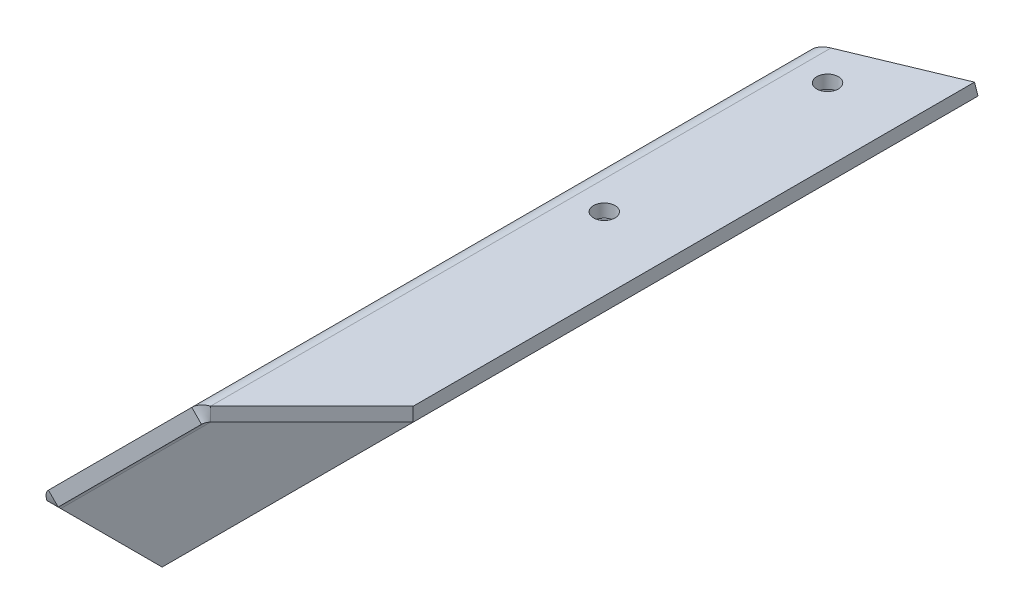
ISO-10303-21;
HEADER;
FILE_DESCRIPTION(('STEP AP214'),'2;1');
FILE_NAME('part.step','',(''),(''),'','','');
FILE_SCHEMA(('AUTOMOTIVE_DESIGN { 1 0 10303 214 1 1 1 1 }'));
ENDSEC;
DATA;
#1=APPLICATION_CONTEXT('core data for automotive mechanical design processes');
#2=APPLICATION_PROTOCOL_DEFINITION('international standard','automotive_design',2000,#1);
#3=PRODUCT_CONTEXT('',#1,'mechanical');
#4=PRODUCT('Part','Part','',(#3));
#5=PRODUCT_RELATED_PRODUCT_CATEGORY('part','',(#4));
#6=PRODUCT_DEFINITION_FORMATION('','',#4);
#7=PRODUCT_DEFINITION_CONTEXT('part definition',#1,'design');
#8=PRODUCT_DEFINITION('design','',#6,#7);
#9=PRODUCT_DEFINITION_SHAPE('','',#8);
#10=(LENGTH_UNIT() NAMED_UNIT(*) SI_UNIT(.MILLI.,.METRE.));
#11=(NAMED_UNIT(*) PLANE_ANGLE_UNIT() SI_UNIT($,.RADIAN.));
#12=(NAMED_UNIT(*) SI_UNIT($,.STERADIAN.) SOLID_ANGLE_UNIT());
#13=UNCERTAINTY_MEASURE_WITH_UNIT(LENGTH_MEASURE(1.E-05),#10,'distance_accuracy_value','');
#14=(GEOMETRIC_REPRESENTATION_CONTEXT(3) GLOBAL_UNCERTAINTY_ASSIGNED_CONTEXT((#13)) GLOBAL_UNIT_ASSIGNED_CONTEXT((#10,
#11,#12)) REPRESENTATION_CONTEXT('',''));
#15=CARTESIAN_POINT('',(0.,0.,0.));
#16=DIRECTION('',(0.,0.,1.));
#17=DIRECTION('',(1.,0.,0.));
#18=AXIS2_PLACEMENT_3D('',#15,#16,#17);
#19=CARTESIAN_POINT('',(-93.8086894866069,111.769201728745,112.900713999999));
#20=DIRECTION('',(0.707106781186544,-0.707106781186551,0.));
#21=DIRECTION('',(0.,0.,-1.));
#22=AXIS2_PLACEMENT_3D('',#19,#20,#21);
#23=PLANE('',#22);
#24=DIRECTION('',(-0.702428633356952,-0.702428633356945,0.114839148728036));
#25=VECTOR('',#24,1.);
#26=CARTESIAN_POINT('',(-101.157491422329,104.420399793023,23.0009026953148));
#27=LINE('',#26,#25);
#28=CARTESIAN_POINT('',(-94.4931223603302,111.084768855022,21.9113536172371));
#29=VERTEX_POINT('',#28);
#30=CARTESIAN_POINT('',(-111.084768855022,94.4931223603303,24.6239004425864));
#31=VERTEX_POINT('',#30);
#32=EDGE_CURVE('E201',#29,#31,#27,.T.);
#33=ORIENTED_EDGE('',*,*,#32,.F.);
#34=DIRECTION('',(0.,0.,1.));
#35=VECTOR('',#34,1.);
#36=CARTESIAN_POINT('',(-94.4931223603302,111.084768855022,112.900713999999));
#37=LINE('',#36,#35);
#38=CARTESIAN_POINT('',(-94.4931223603302,111.084768855022,94.4931223603293));
#39=VERTEX_POINT('',#38);
#40=EDGE_CURVE('E104',#39,#29,#37,.F.);
#41=ORIENTED_EDGE('',*,*,#40,.F.);
#42=DIRECTION('',(-0.707106781186551,-0.707106781186544,0.));
#43=VECTOR('',#42,1.);
#44=CARTESIAN_POINT('',(-94.4931223603302,111.084768855022,94.4931223603293));
#45=LINE('',#44,#43);
#46=CARTESIAN_POINT('',(-111.084768855022,94.4931223603304,94.4931223603293));
#47=VERTEX_POINT('',#46);
#48=EDGE_CURVE('E219',#39,#47,#45,.T.);
#49=ORIENTED_EDGE('',*,*,#48,.T.);
#50=DIRECTION('',(0.,0.,-1.));
#51=VECTOR('',#50,1.);
#52=CARTESIAN_POINT('',(-111.084768855022,94.4931223603303,-112.900714000001));
#53=LINE('',#52,#51);
#54=EDGE_CURVE('E36',#31,#47,#53,.F.);
#55=ORIENTED_EDGE('',*,*,#54,.F.);
#56=EDGE_LOOP('',(#33,#41,#49,#55));
#57=FACE_BOUND('',#56,.T.);
#58=ADVANCED_FACE('F32',(#57),#23,.T.);
#59=CARTESIAN_POINT('',(-94.9402017578616,112.900714,112.900713999999));
#60=DIRECTION('',(0.707106781186544,-0.707106781186551,0.));
#61=DIRECTION('',(0.,0.,-1.));
#62=AXIS2_PLACEMENT_3D('',#59,#60,#61);
#63=PLANE('',#62);
#64=DIRECTION('',(0.,0.,1.));
#65=VECTOR('',#64,1.);
#66=CARTESIAN_POINT('',(-95.6246346315849,112.216281126277,112.900713999999));
#67=LINE('',#66,#65);
#68=CARTESIAN_POINT('',(-95.6246346315849,112.216281126277,94.4931223603293));
#69=VERTEX_POINT('',#68);
#70=CARTESIAN_POINT('',(-95.6246346315849,112.216281126277,22.6683393567157));
#71=VERTEX_POINT('',#70);
#72=EDGE_CURVE('E110',#69,#71,#67,.F.);
#73=ORIENTED_EDGE('',*,*,#72,.T.);
#74=DIRECTION('',(-0.702428633356952,-0.702428633356945,0.114839148728036));
#75=VECTOR('',#74,1.);
#76=CARTESIAN_POINT('',(-102.227940450061,105.612975307801,23.7479052840906));
#77=LINE('',#76,#75);
#78=CARTESIAN_POINT('',(-112.216281126277,95.6246346315851,25.380886182065));
#79=VERTEX_POINT('',#78);
#80=EDGE_CURVE('E198',#71,#79,#77,.T.);
#81=ORIENTED_EDGE('',*,*,#80,.T.);
#82=DIRECTION('',(0.,0.,-1.));
#83=VECTOR('',#82,1.);
#84=CARTESIAN_POINT('',(-112.216281126277,95.6246346315851,-112.900714000001));
#85=LINE('',#84,#83);
#86=CARTESIAN_POINT('',(-112.216281126277,95.6246346315851,94.4931223603293));
#87=VERTEX_POINT('',#86);
#88=EDGE_CURVE('E42',#79,#87,#85,.F.);
#89=ORIENTED_EDGE('',*,*,#88,.T.);
#90=DIRECTION('',(0.707106781186551,0.707106781186544,0.));
#91=VECTOR('',#90,1.);
#92=CARTESIAN_POINT('',(-94.9402017578616,112.900714,94.4931223603293));
#93=LINE('',#92,#91);
#94=EDGE_CURVE('E220',#69,#87,#93,.F.);
#95=ORIENTED_EDGE('',*,*,#94,.F.);
#96=EDGE_LOOP('',(#73,#81,#89,#95));
#97=FACE_BOUND('',#96,.T.);
#98=ADVANCED_FACE('F34',(#97),#63,.F.);
#99=CARTESIAN_POINT('',(-93.9722675053082,110.563914,112.900713999999));
#100=DIRECTION('',(0.,0.,1.));
#101=DIRECTION('',(0.,1.,0.));
#102=AXIS2_PLACEMENT_3D('',#99,#100,#101);
#103=CYLINDRICAL_SURFACE('',#102,2.3368);
#104=CARTESIAN_POINT('',(-93.9722675053082,110.563914,21.5628998641438));
#105=DIRECTION('',(0.374230803028497,-0.22724442901572,0.899061330247256));
#106=DIRECTION('',(-0.768476455717074,0.466642489015403,0.437822708929121));
#107=AXIS2_PLACEMENT_3D('',#104,#105,#106);
#108=ELLIPSE('',#107,2.59915527604478,2.3368);
#109=CARTESIAN_POINT('',(-93.9722675053082,112.900714,22.1535434207718));
#110=VERTEX_POINT('',#109);
#111=EDGE_CURVE('E207',#71,#110,#108,.F.);
#112=ORIENTED_EDGE('',*,*,#111,.F.);
#113=ORIENTED_EDGE('',*,*,#72,.F.);
#114=CARTESIAN_POINT('',(-93.9722675053082,110.563914,93.9722675053073));
#115=DIRECTION('',(-0.300635186420926,0.,-0.953739212093985));
#116=DIRECTION('',(-0.953739212093985,0.,0.300635186420926));
#117=AXIS2_PLACEMENT_3D('',#114,#115,#116);
#118=ELLIPSE('',#117,2.45014566913887,2.3368);
#119=CARTESIAN_POINT('',(-93.9722675053082,112.900714,93.9722675053073));
#120=VERTEX_POINT('',#119);
#121=EDGE_CURVE('E145',#120,#69,#118,.F.);
#122=ORIENTED_EDGE('',*,*,#121,.F.);
#123=DIRECTION('',(0.,0.,1.));
#124=VECTOR('',#123,1.);
#125=CARTESIAN_POINT('',(-93.9722675053082,112.900714,-112.900714000001));
#126=LINE('',#125,#124);
#127=EDGE_CURVE('E96',#120,#110,#126,.F.);
#128=ORIENTED_EDGE('',*,*,#127,.T.);
#129=EDGE_LOOP('',(#112,#113,#122,#128));
#130=FACE_BOUND('',#129,.T.);
#131=ADVANCED_FACE('F279',(#130),#103,.T.);
#132=CARTESIAN_POINT('',(-93.9722675053082,110.563914,112.900713999999));
#133=DIRECTION('',(0.,0.,1.));
#134=DIRECTION('',(0.,1.,0.));
#135=AXIS2_PLACEMENT_3D('',#132,#133,#134);
#136=CYLINDRICAL_SURFACE('',#135,0.736599999999998);
#137=ORIENTED_EDGE('',*,*,#40,.T.);
#138=CARTESIAN_POINT('',(-93.9722675053082,110.563914,21.5628998641438));
#139=DIRECTION('',(0.374230803028497,-0.22724442901572,0.899061330247256));
#140=DIRECTION('',(-0.768476455717074,0.466642489015403,0.437822708929121));
#141=AXIS2_PLACEMENT_3D('',#138,#139,#140);
#142=ELLIPSE('',#141,0.819298945709768,0.736599999999998);
#143=CARTESIAN_POINT('',(-93.9722675053082,111.300514,21.7490809852548));
#144=VERTEX_POINT('',#143);
#145=EDGE_CURVE('E204',#29,#144,#142,.F.);
#146=ORIENTED_EDGE('',*,*,#145,.T.);
#147=DIRECTION('',(0.,0.,1.));
#148=VECTOR('',#147,1.);
#149=CARTESIAN_POINT('',(-93.9722675053082,111.300514,-112.900714000001));
#150=LINE('',#149,#148);
#151=CARTESIAN_POINT('',(-93.9722675053082,111.300514,93.9722675053073));
#152=VERTEX_POINT('',#151);
#153=EDGE_CURVE('E93',#144,#152,#150,.T.);
#154=ORIENTED_EDGE('',*,*,#153,.T.);
#155=CARTESIAN_POINT('',(-93.9722675053082,110.563914,93.9722675053073));
#156=DIRECTION('',(-0.707106781186546,0.,-0.707106781186549));
#157=DIRECTION('',(-0.707106781186549,0.,0.707106781186546));
#158=AXIS2_PLACEMENT_3D('',#155,#156,#157);
#159=ELLIPSE('',#158,1.04170971004402,0.736599999999998);
#160=EDGE_CURVE('E134',#152,#39,#159,.F.);
#161=ORIENTED_EDGE('',*,*,#160,.T.);
#162=EDGE_LOOP('',(#137,#146,#154,#161));
#163=FACE_BOUND('',#162,.T.);
#164=ADVANCED_FACE('F296',(#163),#136,.F.);
#165=CARTESIAN_POINT('',(-82.2402017578616,112.900714,-112.900714000001));
#166=DIRECTION('',(0.,-1.,0.));
#167=DIRECTION('',(1.,0.,0.));
#168=AXIS2_PLACEMENT_3D('',#165,#166,#167);
#169=PLANE('',#168);
#170=CARTESIAN_POINT('',(-90.675714,112.900714,51.6878569999991));
#171=DIRECTION('',(0.,1.,0.));
#172=DIRECTION('',(-1.,0.,0.));
#173=AXIS2_PLACEMENT_3D('',#170,#171,#172);
#174=CIRCLE('',#173,1.2446);
#175=CARTESIAN_POINT('',(-91.920314,112.900714,51.6878569999991));
#176=VERTEX_POINT('',#175);
#177=EDGE_CURVE('E223',#176,#176,#174,.T.);
#178=ORIENTED_EDGE('',*,*,#177,.F.);
#179=EDGE_LOOP('',(#178));
#180=FACE_BOUND('',#179,.T.);
#181=CARTESIAN_POINT('',(-90.675714,112.900714,25.8439284999991));
#182=DIRECTION('',(0.,1.,0.));
#183=DIRECTION('',(-1.,0.,0.));
#184=AXIS2_PLACEMENT_3D('',#181,#182,#183);
#185=CIRCLE('',#184,1.2446);
#186=CARTESIAN_POINT('',(-91.920314,112.900714,25.8439284999991));
#187=VERTEX_POINT('',#186);
#188=EDGE_CURVE('E139',#187,#187,#185,.T.);
#189=ORIENTED_EDGE('',*,*,#188,.F.);
#190=EDGE_LOOP('',(#189));
#191=FACE_BOUND('',#190,.T.);
#192=DIRECTION('',(0.,0.,-1.));
#193=VECTOR('',#192,1.);
#194=CARTESIAN_POINT('',(-82.2402017578616,112.900714,-112.900714000001));
#195=LINE('',#194,#193);
#196=CARTESIAN_POINT('',(-82.2402017578616,112.900714,82.2402017578608));
#197=VERTEX_POINT('',#196);
#198=CARTESIAN_POINT('',(-82.2402017578616,112.900714,17.2701164084648));
#199=VERTEX_POINT('',#198);
#200=EDGE_CURVE('E101',#197,#199,#195,.T.);
#201=ORIENTED_EDGE('',*,*,#200,.T.);
#202=DIRECTION('',(-0.923214701144147,0.,0.384284550289657));
#203=VECTOR('',#202,1.);
#204=CARTESIAN_POINT('',(-36.0585660205562,112.900714,-1.95281093330875));
#205=LINE('',#204,#203);
#206=EDGE_CURVE('E213',#199,#110,#205,.T.);
#207=ORIENTED_EDGE('',*,*,#206,.T.);
#208=ORIENTED_EDGE('',*,*,#127,.F.);
#209=DIRECTION('',(0.707106781186549,0.,-0.707106781186546));
#210=VECTOR('',#209,1.);
#211=CARTESIAN_POINT('',(15.3302561210693,112.900714,-15.3302561210697));
#212=LINE('',#211,#210);
#213=EDGE_CURVE('E238',#120,#197,#212,.T.);
#214=ORIENTED_EDGE('',*,*,#213,.T.);
#215=EDGE_LOOP('',(#201,#207,#208,#214));
#216=FACE_BOUND('',#215,.T.);
#217=ADVANCED_FACE('F299',(#180,#191,#216),#169,.F.);
#218=CARTESIAN_POINT('',(-82.2402017578616,111.300514,-112.900714000001));
#219=DIRECTION('',(0.,-1.,0.));
#220=DIRECTION('',(1.,0.,0.));
#221=AXIS2_PLACEMENT_3D('',#218,#219,#220);
#222=PLANE('',#221);
#223=DIRECTION('',(-0.923214701144147,0.,0.384284550289657));
#224=VECTOR('',#223,1.);
#225=CARTESIAN_POINT('',(-36.2020600491943,111.300514,-2.29754453413962));
#226=LINE('',#225,#224);
#227=CARTESIAN_POINT('',(-82.2402017578616,111.300514,16.8656539729479));
#228=VERTEX_POINT('',#227);
#229=EDGE_CURVE('E210',#228,#144,#226,.T.);
#230=ORIENTED_EDGE('',*,*,#229,.F.);
#231=DIRECTION('',(0.,0.,1.));
#232=VECTOR('',#231,1.);
#233=CARTESIAN_POINT('',(-82.2402017578616,111.300514,-112.900714000001));
#234=LINE('',#233,#232);
#235=CARTESIAN_POINT('',(-82.2402017578616,111.300514,82.2402017578608));
#236=VERTEX_POINT('',#235);
#237=EDGE_CURVE('E105',#236,#228,#234,.F.);
#238=ORIENTED_EDGE('',*,*,#237,.F.);
#239=DIRECTION('',(0.707106781186549,0.,-0.707106781186546));
#240=VECTOR('',#239,1.);
#241=CARTESIAN_POINT('',(15.3302561210693,111.300514,-15.3302561210697));
#242=LINE('',#241,#240);
#243=EDGE_CURVE('E144',#152,#236,#242,.T.);
#244=ORIENTED_EDGE('',*,*,#243,.F.);
#245=ORIENTED_EDGE('',*,*,#153,.F.);
#246=EDGE_LOOP('',(#230,#238,#244,#245));
#247=FACE_BOUND('',#246,.T.);
#248=CARTESIAN_POINT('',(-90.675714,111.300514,51.6878569999991));
#249=DIRECTION('',(0.,-1.,0.));
#250=DIRECTION('',(1.,0.,0.));
#251=AXIS2_PLACEMENT_3D('',#248,#249,#250);
#252=CIRCLE('',#251,1.11778190344489);
#253=CARTESIAN_POINT('',(-89.5579320965551,111.300514,51.6878569999991));
#254=VERTEX_POINT('',#253);
#255=EDGE_CURVE('E136',#254,#254,#252,.T.);
#256=ORIENTED_EDGE('',*,*,#255,.F.);
#257=EDGE_LOOP('',(#256));
#258=FACE_BOUND('',#257,.T.);
#259=CARTESIAN_POINT('',(-90.675714,111.300514,25.8439284999991));
#260=DIRECTION('',(0.,-1.,0.));
#261=DIRECTION('',(1.,0.,0.));
#262=AXIS2_PLACEMENT_3D('',#259,#260,#261);
#263=CIRCLE('',#262,1.11778190344489);
#264=CARTESIAN_POINT('',(-89.5579320965551,111.300514,25.8439284999991));
#265=VERTEX_POINT('',#264);
#266=EDGE_CURVE('E131',#265,#265,#263,.T.);
#267=ORIENTED_EDGE('',*,*,#266,.F.);
#268=EDGE_LOOP('',(#267));
#269=FACE_BOUND('',#268,.T.);
#270=ADVANCED_FACE('F306',(#247,#258,#269),#222,.T.);
#271=CARTESIAN_POINT('',(-82.2402017578616,112.900714,-112.900714000001));
#272=DIRECTION('',(-1.,0.,0.));
#273=DIRECTION('',(0.,-1.,0.));
#274=AXIS2_PLACEMENT_3D('',#271,#272,#273);
#275=PLANE('',#274);
#276=ORIENTED_EDGE('',*,*,#237,.T.);
#277=DIRECTION('',(0.,0.969510212842494,0.245050907352128));
#278=VECTOR('',#277,1.);
#279=CARTESIAN_POINT('',(-82.2402017578616,81.9748117665948,9.45336491622416));
#280=LINE('',#279,#278);
#281=EDGE_CURVE('E216',#228,#199,#280,.T.);
#282=ORIENTED_EDGE('',*,*,#281,.T.);
#283=ORIENTED_EDGE('',*,*,#200,.F.);
#284=DIRECTION('',(0.,-1.,0.));
#285=VECTOR('',#284,1.);
#286=CARTESIAN_POINT('',(-82.2402017578616,111.300514,82.2402017578608));
#287=LINE('',#286,#285);
#288=EDGE_CURVE('E244',#236,#197,#287,.F.);
#289=ORIENTED_EDGE('',*,*,#288,.F.);
#290=EDGE_LOOP('',(#276,#282,#283,#289));
#291=FACE_BOUND('',#290,.T.);
#292=ADVANCED_FACE('F288',(#291),#275,.F.);
#293=CARTESIAN_POINT('',(-110.563914,93.9722675053083,-112.900714000001));
#294=DIRECTION('',(0.,0.,-1.));
#295=DIRECTION('',(-1.,0.,0.));
#296=AXIS2_PLACEMENT_3D('',#293,#294,#295);
#297=CYLINDRICAL_SURFACE('',#296,2.3368);
#298=CARTESIAN_POINT('',(-110.563914,93.9722675053083,24.2754466894932));
#299=DIRECTION('',(0.374230803028497,-0.22724442901572,0.899061330247256));
#300=DIRECTION('',(0.768476455717074,-0.466642489015403,-0.437822708929121));
#301=AXIS2_PLACEMENT_3D('',#298,#299,#300);
#302=ELLIPSE('',#301,2.59915527604478,2.3368);
#303=CARTESIAN_POINT('',(-112.900714,93.9722675053084,25.2481306556431));
#304=VERTEX_POINT('',#303);
#305=EDGE_CURVE('E195',#304,#79,#302,.F.);
#306=ORIENTED_EDGE('',*,*,#305,.F.);
#307=DIRECTION('',(0.,0.,-1.));
#308=VECTOR('',#307,1.);
#309=CARTESIAN_POINT('',(-112.900714,93.9722675053084,112.900713999999));
#310=LINE('',#309,#308);
#311=CARTESIAN_POINT('',(-112.900714,93.9722675053084,93.9722675053073));
#312=VERTEX_POINT('',#311);
#313=EDGE_CURVE('E115',#304,#312,#310,.F.);
#314=ORIENTED_EDGE('',*,*,#313,.T.);
#315=CARTESIAN_POINT('',(-110.563914,93.9722675053084,93.9722675053073));
#316=DIRECTION('',(0.,-0.300635186420936,0.953739212093982));
#317=DIRECTION('',(0.,-0.953739212093982,-0.300635186420936));
#318=AXIS2_PLACEMENT_3D('',#315,#316,#317);
#319=ELLIPSE('',#318,2.45014566913888,2.3368);
#320=EDGE_CURVE('E158',#312,#87,#319,.F.);
#321=ORIENTED_EDGE('',*,*,#320,.T.);
#322=ORIENTED_EDGE('',*,*,#88,.F.);
#323=EDGE_LOOP('',(#306,#314,#321,#322));
#324=FACE_BOUND('',#323,.T.);
#325=ADVANCED_FACE('F285',(#324),#297,.T.);
#326=CARTESIAN_POINT('',(-110.563914,93.9722675053083,-112.900714000001));
#327=DIRECTION('',(0.,0.,-1.));
#328=DIRECTION('',(-1.,0.,0.));
#329=AXIS2_PLACEMENT_3D('',#326,#327,#328);
#330=CYLINDRICAL_SURFACE('',#329,0.736599999999999);
#331=DIRECTION('',(0.,0.,-1.));
#332=VECTOR('',#331,1.);
#333=CARTESIAN_POINT('',(-111.300514,93.9722675053084,112.900713999999));
#334=LINE('',#333,#332);
#335=CARTESIAN_POINT('',(-111.300514,93.9722675053084,93.9722675053073));
#336=VERTEX_POINT('',#335);
#337=CARTESIAN_POINT('',(-111.300514,93.9722675053084,24.5820535918665));
#338=VERTEX_POINT('',#337);
#339=EDGE_CURVE('E112',#336,#338,#334,.T.);
#340=ORIENTED_EDGE('',*,*,#339,.T.);
#341=CARTESIAN_POINT('',(-110.563914,93.9722675053083,24.2754466894932));
#342=DIRECTION('',(0.374230803028497,-0.22724442901572,0.899061330247256));
#343=DIRECTION('',(0.768476455717074,-0.466642489015403,-0.437822708929121));
#344=AXIS2_PLACEMENT_3D('',#341,#342,#343);
#345=ELLIPSE('',#344,0.819298945709768,0.736599999999999);
#346=EDGE_CURVE('E191',#338,#31,#345,.F.);
#347=ORIENTED_EDGE('',*,*,#346,.T.);
#348=ORIENTED_EDGE('',*,*,#54,.T.);
#349=CARTESIAN_POINT('',(-110.563914,93.9722675053084,93.9722675053073));
#350=DIRECTION('',(0.,-0.707106781186546,0.707106781186549));
#351=DIRECTION('',(0.,-0.707106781186549,-0.707106781186546));
#352=AXIS2_PLACEMENT_3D('',#349,#350,#351);
#353=ELLIPSE('',#352,1.04170971004402,0.736599999999999);
#354=EDGE_CURVE('E124',#336,#47,#353,.F.);
#355=ORIENTED_EDGE('',*,*,#354,.F.);
#356=EDGE_LOOP('',(#340,#347,#348,#355));
#357=FACE_BOUND('',#356,.T.);
#358=ADVANCED_FACE('F181',(#357),#330,.F.);
#359=CARTESIAN_POINT('',(-112.900714,94.2773772153524,-112.900714000001));
#360=DIRECTION('',(1.,0.,0.));
#361=DIRECTION('',(0.,1.,0.));
#362=AXIS2_PLACEMENT_3D('',#359,#360,#361);
#363=PLANE('',#362);
#364=CARTESIAN_POINT('',(-112.900714,90.6757140000002,51.6878569999991));
#365=DIRECTION('',(-1.,0.,0.));
#366=DIRECTION('',(0.,-1.,0.));
#367=AXIS2_PLACEMENT_3D('',#364,#365,#366);
#368=CIRCLE('',#367,1.2446);
#369=CARTESIAN_POINT('',(-112.900714,89.4311140000002,51.6878569999991));
#370=VERTEX_POINT('',#369);
#371=EDGE_CURVE('E247',#370,#370,#368,.T.);
#372=ORIENTED_EDGE('',*,*,#371,.F.);
#373=EDGE_LOOP('',(#372));
#374=FACE_BOUND('',#373,.T.);
#375=CARTESIAN_POINT('',(-112.900714,90.6757140000002,25.8439284999991));
#376=DIRECTION('',(-1.,0.,0.));
#377=DIRECTION('',(0.,-1.,0.));
#378=AXIS2_PLACEMENT_3D('',#375,#376,#377);
#379=CIRCLE('',#378,1.2446);
#380=CARTESIAN_POINT('',(-112.900714,89.4311140000002,25.8439284999991));
#381=VERTEX_POINT('',#380);
#382=EDGE_CURVE('E129',#381,#381,#379,.T.);
#383=ORIENTED_EDGE('',*,*,#382,.F.);
#384=EDGE_LOOP('',(#383));
#385=FACE_BOUND('',#384,.T.);
#386=ORIENTED_EDGE('',*,*,#313,.F.);
#387=DIRECTION('',(0.,-0.969510212842496,-0.245050907352124));
#388=VECTOR('',#387,1.);
#389=CARTESIAN_POINT('',(-112.900714,61.4377416622435,17.0247875979776));
#390=LINE('',#389,#388);
#391=CARTESIAN_POINT('',(-112.900714,82.2402017578618,22.2827638978268));
#392=VERTEX_POINT('',#391);
#393=EDGE_CURVE('E80',#304,#392,#390,.T.);
#394=ORIENTED_EDGE('',*,*,#393,.T.);
#395=DIRECTION('',(0.,0.,1.));
#396=VECTOR('',#395,1.);
#397=CARTESIAN_POINT('',(-112.900714,82.2402017578618,-112.900714000001));
#398=LINE('',#397,#396);
#399=CARTESIAN_POINT('',(-112.900714,82.2402017578618,82.2402017578608));
#400=VERTEX_POINT('',#399);
#401=EDGE_CURVE('E73',#392,#400,#398,.T.);
#402=ORIENTED_EDGE('',*,*,#401,.T.);
#403=DIRECTION('',(0.,0.707106781186549,0.707106781186546));
#404=VECTOR('',#403,1.);
#405=CARTESIAN_POINT('',(-112.900714,112.900714,112.900713999999));
#406=LINE('',#405,#404);
#407=EDGE_CURVE('E77',#400,#312,#406,.T.);
#408=ORIENTED_EDGE('',*,*,#407,.T.);
#409=EDGE_LOOP('',(#386,#394,#402,#408));
#410=FACE_BOUND('',#409,.T.);
#411=ADVANCED_FACE('F76',(#374,#385,#410),#363,.F.);
#412=CARTESIAN_POINT('',(-111.300514,94.2773772153523,-112.900714000001));
#413=DIRECTION('',(1.,0.,0.));
#414=DIRECTION('',(0.,1.,0.));
#415=AXIS2_PLACEMENT_3D('',#412,#413,#414);
#416=PLANE('',#415);
#417=DIRECTION('',(0.,-0.969510212842496,-0.245050907352124));
#418=VECTOR('',#417,1.);
#419=CARTESIAN_POINT('',(-111.300514,61.5959878229973,16.398708426708));
#420=LINE('',#419,#418);
#421=CARTESIAN_POINT('',(-111.300514,82.2402017578618,21.6166868340502));
#422=VERTEX_POINT('',#421);
#423=EDGE_CURVE('E49',#338,#422,#420,.T.);
#424=ORIENTED_EDGE('',*,*,#423,.F.);
#425=ORIENTED_EDGE('',*,*,#339,.F.);
#426=DIRECTION('',(0.,0.707106781186549,0.707106781186546));
#427=VECTOR('',#426,1.);
#428=CARTESIAN_POINT('',(-111.300514,112.900714,112.900713999999));
#429=LINE('',#428,#427);
#430=CARTESIAN_POINT('',(-111.300514,82.2402017578618,82.2402017578608));
#431=VERTEX_POINT('',#430);
#432=EDGE_CURVE('E89',#431,#336,#429,.T.);
#433=ORIENTED_EDGE('',*,*,#432,.F.);
#434=DIRECTION('',(0.,0.,-1.));
#435=VECTOR('',#434,1.);
#436=CARTESIAN_POINT('',(-111.300514,82.2402017578618,112.900713999999));
#437=LINE('',#436,#435);
#438=EDGE_CURVE('E56',#422,#431,#437,.F.);
#439=ORIENTED_EDGE('',*,*,#438,.F.);
#440=EDGE_LOOP('',(#424,#425,#433,#439));
#441=FACE_BOUND('',#440,.T.);
#442=CARTESIAN_POINT('',(-111.300514,90.6757140000002,51.6878569999991));
#443=DIRECTION('',(1.,0.,0.));
#444=DIRECTION('',(0.,1.,0.));
#445=AXIS2_PLACEMENT_3D('',#442,#443,#444);
#446=CIRCLE('',#445,1.11778190344489);
#447=CARTESIAN_POINT('',(-111.300514,91.7934959034451,51.6878569999991));
#448=VERTEX_POINT('',#447);
#449=EDGE_CURVE('E126',#448,#448,#446,.T.);
#450=ORIENTED_EDGE('',*,*,#449,.F.);
#451=EDGE_LOOP('',(#450));
#452=FACE_BOUND('',#451,.T.);
#453=CARTESIAN_POINT('',(-111.300514,90.6757140000002,25.8439284999991));
#454=DIRECTION('',(1.,0.,0.));
#455=DIRECTION('',(0.,1.,0.));
#456=AXIS2_PLACEMENT_3D('',#453,#454,#455);
#457=CIRCLE('',#456,1.11778190344489);
#458=CARTESIAN_POINT('',(-111.300514,91.7934959034451,25.8439284999991));
#459=VERTEX_POINT('',#458);
#460=EDGE_CURVE('E121',#459,#459,#457,.T.);
#461=ORIENTED_EDGE('',*,*,#460,.F.);
#462=EDGE_LOOP('',(#461));
#463=FACE_BOUND('',#462,.T.);
#464=ADVANCED_FACE('F186',(#441,#452,#463),#416,.T.);
#465=CARTESIAN_POINT('',(-112.900714,82.2402017578618,112.900713999999));
#466=DIRECTION('',(0.,1.,0.));
#467=DIRECTION('',(-1.,0.,0.));
#468=AXIS2_PLACEMENT_3D('',#465,#466,#467);
#469=PLANE('',#468);
#470=ORIENTED_EDGE('',*,*,#401,.F.);
#471=DIRECTION('',(0.923214701144146,0.,-0.384284550289659));
#472=VECTOR('',#471,1.);
#473=CARTESIAN_POINT('',(-145.049891736272,82.2402017578621,35.664734844839));
#474=LINE('',#473,#472);
#475=EDGE_CURVE('E11',#392,#422,#474,.T.);
#476=ORIENTED_EDGE('',*,*,#475,.T.);
#477=ORIENTED_EDGE('',*,*,#438,.T.);
#478=DIRECTION('',(-1.,0.,0.));
#479=VECTOR('',#478,1.);
#480=CARTESIAN_POINT('',(-112.900714,82.2402017578618,82.2402017578608));
#481=LINE('',#480,#479);
#482=EDGE_CURVE('E85',#400,#431,#481,.F.);
#483=ORIENTED_EDGE('',*,*,#482,.F.);
#484=EDGE_LOOP('',(#470,#476,#477,#483));
#485=FACE_BOUND('',#484,.T.);
#486=ADVANCED_FACE('F92',(#485),#469,.F.);
#487=CARTESIAN_POINT('',(-112.900714,112.900714,112.900713999999));
#488=DIRECTION('',(0.,0.707106781186546,-0.707106781186549));
#489=DIRECTION('',(0.,0.707106781186549,0.707106781186546));
#490=AXIS2_PLACEMENT_3D('',#487,#488,#489);
#491=PLANE('',#490);
#492=ORIENTED_EDGE('',*,*,#407,.F.);
#493=ORIENTED_EDGE('',*,*,#482,.T.);
#494=ORIENTED_EDGE('',*,*,#432,.T.);
#495=DIRECTION('',(-1.,0.,0.));
#496=VECTOR('',#495,1.);
#497=CARTESIAN_POINT('',(-112.900714,93.9722675053084,93.9722675053073));
#498=LINE('',#497,#496);
#499=EDGE_CURVE('E88',#312,#336,#498,.F.);
#500=ORIENTED_EDGE('',*,*,#499,.F.);
#501=EDGE_LOOP('',(#492,#493,#494,#500));
#502=FACE_BOUND('',#501,.T.);
#503=ADVANCED_FACE('F84',(#502),#491,.F.);
#504=CARTESIAN_POINT('',(-110.563914,91.6354675053084,93.2356675053073));
#505=CARTESIAN_POINT('',(-110.563914,92.1688675053084,93.2356675053073));
#506=CARTESIAN_POINT('',(-110.563914,92.7022675053084,93.2356675053073));
#507=CARTESIAN_POINT('',(-110.563914,93.2356675053083,93.2356675053073));
#508=CARTESIAN_POINT('',(-115.237514,91.6354675053084,93.2356675053073));
#509=CARTESIAN_POINT('',(-114.170714,92.1688675053084,93.2356675053073));
#510=CARTESIAN_POINT('',(-113.103914,92.7022675053084,93.2356675053074));
#511=CARTESIAN_POINT('',(-112.037114,93.2356675053084,93.2356675053073));
#512=CARTESIAN_POINT('',(-115.237514,96.3090675053084,94.7088675053073));
#513=CARTESIAN_POINT('',(-114.170714,95.7756675053084,94.7088675053074));
#514=CARTESIAN_POINT('',(-113.103914,95.2422675053084,94.7088675053074));
#515=CARTESIAN_POINT('',(-112.037114,94.7088675053084,94.7088675053073));
#516=CARTESIAN_POINT('',(-110.563914,96.3090675053083,94.7088675053073));
#517=CARTESIAN_POINT('',(-110.563914,95.7756675053083,94.7088675053073));
#518=CARTESIAN_POINT('',(-110.563914,95.2422675053083,94.7088675053073));
#519=CARTESIAN_POINT('',(-110.563914,94.7088675053083,94.7088675053073));
#520=CARTESIAN_POINT('',(-105.890314,96.3090675053083,94.7088675053073));
#521=CARTESIAN_POINT('',(-106.957114,95.7756675053083,94.7088675053074));
#522=CARTESIAN_POINT('',(-108.023914,95.2422675053083,94.7088675053074));
#523=CARTESIAN_POINT('',(-109.090714,94.7088675053083,94.7088675053073));
#524=CARTESIAN_POINT('',(-105.890314,91.6354675053083,93.2356675053073));
#525=CARTESIAN_POINT('',(-106.957114,92.1688675053083,93.2356675053073));
#526=CARTESIAN_POINT('',(-108.023914,92.7022675053083,93.2356675053074));
#527=CARTESIAN_POINT('',(-109.090714,93.2356675053083,93.2356675053073));
#528=CARTESIAN_POINT('',(-110.563914,91.6354675053084,93.2356675053073));
#529=CARTESIAN_POINT('',(-110.563914,92.1688675053084,93.2356675053073));
#530=CARTESIAN_POINT('',(-110.563914,92.7022675053084,93.2356675053073));
#531=CARTESIAN_POINT('',(-110.563914,93.2356675053083,93.2356675053073));
#532=(BOUNDED_SURFACE() B_SPLINE_SURFACE(3,3,((#504,#505,#506,#507),(#508,#509,#510,#511),(#512,
#513,#514,#515),(#516,#517,#518,#519),(#520,#521,#522,#523),(#524,#525,#526,#527),(#528,#529,
#530,#531)),.UNSPECIFIED.,.T.,.F.,.F.) B_SPLINE_SURFACE_WITH_KNOTS((4,3,4),(4,4),(0.,0.5,1.),
(0.,1.),.UNSPECIFIED.) GEOMETRIC_REPRESENTATION_ITEM() RATIONAL_B_SPLINE_SURFACE(((1.,1.,1.,1.),
(0.333333333333333,0.333333333333333,0.333333333333333,0.333333333333333),(0.333333333333333,
0.333333333333333,0.333333333333333,0.333333333333333),(1.,1.,1.,1.),(0.333333333333333,
0.333333333333333,0.333333333333333,0.333333333333333),(0.333333333333333,0.333333333333333,
0.333333333333333,0.333333333333333),(1.,1.,1.,1.))) REPRESENTATION_ITEM('') SURFACE());
#533=DIRECTION('',(0.707106781186544,-0.707106781186551,0.));
#534=VECTOR('',#533,1.);
#535=CARTESIAN_POINT('',(-111.084768855022,94.4931223603304,94.4931223603293));
#536=LINE('',#535,#534);
#537=EDGE_CURVE('E90',#47,#87,#536,.F.);
#538=ORIENTED_EDGE('',*,*,#354,.T.);
#539=ORIENTED_EDGE('',*,*,#537,.T.);
#540=ORIENTED_EDGE('',*,*,#320,.F.);
#541=ORIENTED_EDGE('',*,*,#499,.T.);
#542=EDGE_LOOP('',(#538,#539,#540,#541));
#543=FACE_BOUND('',#542,.T.);
#544=ADVANCED_FACE('F178',(#543),#532,.F.);
#545=CARTESIAN_POINT('',(-111.376714,90.6757140000002,25.8439284999991));
#546=DIRECTION('',(-1.,0.,0.));
#547=DIRECTION('',(0.,-1.,0.));
#548=AXIS2_PLACEMENT_3D('',#545,#546,#547);
#549=CONICAL_SURFACE('',#548,1.2446,1.02974425867665);
#550=ORIENTED_EDGE('',*,*,#460,.T.);
#551=EDGE_LOOP('',(#550));
#552=FACE_BOUND('',#551,.T.);
#553=CARTESIAN_POINT('',(-111.376714,90.6757140000002,25.8439284999991));
#554=DIRECTION('',(-1.,0.,0.));
#555=DIRECTION('',(0.,-1.,0.));
#556=AXIS2_PLACEMENT_3D('',#553,#554,#555);
#557=CIRCLE('',#556,1.2446);
#558=CARTESIAN_POINT('',(-111.376714,89.4311140000002,25.8439284999991));
#559=VERTEX_POINT('',#558);
#560=EDGE_CURVE('E125',#559,#559,#557,.T.);
#561=ORIENTED_EDGE('',*,*,#560,.T.);
#562=EDGE_LOOP('',(#561));
#563=FACE_BOUND('',#562,.T.);
#564=ADVANCED_FACE('F259',(#552,#563),#549,.F.);
#565=CARTESIAN_POINT('',(-112.900714,90.6757140000002,25.8439284999991));
#566=DIRECTION('',(-1.,0.,0.));
#567=DIRECTION('',(0.,-1.,0.));
#568=AXIS2_PLACEMENT_3D('',#565,#566,#567);
#569=CYLINDRICAL_SURFACE('',#568,1.2446);
#570=ORIENTED_EDGE('',*,*,#560,.F.);
#571=EDGE_LOOP('',(#570));
#572=FACE_BOUND('',#571,.T.);
#573=ORIENTED_EDGE('',*,*,#382,.T.);
#574=EDGE_LOOP('',(#573));
#575=FACE_BOUND('',#574,.T.);
#576=ADVANCED_FACE('F261',(#572,#575),#569,.F.);
#577=CARTESIAN_POINT('',(-111.376714,90.6757140000002,51.6878569999991));
#578=DIRECTION('',(-1.,0.,0.));
#579=DIRECTION('',(0.,-1.,0.));
#580=AXIS2_PLACEMENT_3D('',#577,#578,#579);
#581=CONICAL_SURFACE('',#580,1.2446,1.02974425867665);
#582=ORIENTED_EDGE('',*,*,#449,.T.);
#583=EDGE_LOOP('',(#582));
#584=FACE_BOUND('',#583,.T.);
#585=CARTESIAN_POINT('',(-111.376714,90.6757140000002,51.6878569999991));
#586=DIRECTION('',(-1.,0.,0.));
#587=DIRECTION('',(0.,-1.,0.));
#588=AXIS2_PLACEMENT_3D('',#585,#586,#587);
#589=CIRCLE('',#588,1.2446);
#590=CARTESIAN_POINT('',(-111.376714,89.4311140000002,51.6878569999991));
#591=VERTEX_POINT('',#590);
#592=EDGE_CURVE('E130',#591,#591,#589,.T.);
#593=ORIENTED_EDGE('',*,*,#592,.T.);
#594=EDGE_LOOP('',(#593));
#595=FACE_BOUND('',#594,.T.);
#596=ADVANCED_FACE('F263',(#584,#595),#581,.F.);
#597=CARTESIAN_POINT('',(-112.900714,90.6757140000002,51.6878569999991));
#598=DIRECTION('',(-1.,0.,0.));
#599=DIRECTION('',(0.,-1.,0.));
#600=AXIS2_PLACEMENT_3D('',#597,#598,#599);
#601=CYLINDRICAL_SURFACE('',#600,1.2446);
#602=ORIENTED_EDGE('',*,*,#592,.F.);
#603=EDGE_LOOP('',(#602));
#604=FACE_BOUND('',#603,.T.);
#605=ORIENTED_EDGE('',*,*,#371,.T.);
#606=EDGE_LOOP('',(#605));
#607=FACE_BOUND('',#606,.T.);
#608=ADVANCED_FACE('F269',(#604,#607),#601,.F.);
#609=CARTESIAN_POINT('',(15.3302561210693,111.300514,-15.3302561210697));
#610=DIRECTION('',(-0.707106781186546,0.,-0.707106781186549));
#611=DIRECTION('',(0.707106781186549,0.,-0.707106781186546));
#612=AXIS2_PLACEMENT_3D('',#609,#610,#611);
#613=PLANE('',#612);
#614=ORIENTED_EDGE('',*,*,#243,.T.);
#615=ORIENTED_EDGE('',*,*,#288,.T.);
#616=ORIENTED_EDGE('',*,*,#213,.F.);
#617=DIRECTION('',(0.,-1.,0.));
#618=VECTOR('',#617,1.);
#619=CARTESIAN_POINT('',(-93.9722675053082,111.300514,93.9722675053073));
#620=LINE('',#619,#618);
#621=EDGE_CURVE('E241',#152,#120,#620,.F.);
#622=ORIENTED_EDGE('',*,*,#621,.F.);
#623=EDGE_LOOP('',(#614,#615,#616,#622));
#624=FACE_BOUND('',#623,.T.);
#625=ADVANCED_FACE('F354',(#624),#613,.F.);
#626=CARTESIAN_POINT('',(-96.3090675053081,110.563914,94.7088675053073));
#627=CARTESIAN_POINT('',(-95.7756675053082,110.563914,94.7088675053073));
#628=CARTESIAN_POINT('',(-95.2422675053082,110.563914,94.7088675053073));
#629=CARTESIAN_POINT('',(-94.7088675053082,110.563914,94.7088675053073));
#630=CARTESIAN_POINT('',(-96.3090675053081,105.890314,94.7088675053073));
#631=CARTESIAN_POINT('',(-95.7756675053081,106.957114,94.7088675053073));
#632=CARTESIAN_POINT('',(-95.2422675053081,108.023914,94.7088675053073));
#633=CARTESIAN_POINT('',(-94.7088675053082,109.090714,94.7088675053073));
#634=CARTESIAN_POINT('',(-91.6354675053082,105.890314,93.2356675053073));
#635=CARTESIAN_POINT('',(-92.1688675053082,106.957114,93.2356675053073));
#636=CARTESIAN_POINT('',(-92.7022675053082,108.023914,93.2356675053073));
#637=CARTESIAN_POINT('',(-93.2356675053082,109.090714,93.2356675053073));
#638=CARTESIAN_POINT('',(-91.6354675053082,110.563914,93.2356675053073));
#639=CARTESIAN_POINT('',(-92.1688675053082,110.563914,93.2356675053073));
#640=CARTESIAN_POINT('',(-92.7022675053082,110.563914,93.2356675053073));
#641=CARTESIAN_POINT('',(-93.2356675053082,110.563914,93.2356675053073));
#642=CARTESIAN_POINT('',(-91.6354675053082,115.237514,93.2356675053073));
#643=CARTESIAN_POINT('',(-92.1688675053082,114.170714,93.2356675053073));
#644=CARTESIAN_POINT('',(-92.7022675053082,113.103914,93.2356675053073));
#645=CARTESIAN_POINT('',(-93.2356675053082,112.037114,93.2356675053073));
#646=CARTESIAN_POINT('',(-96.3090675053081,115.237514,94.7088675053073));
#647=CARTESIAN_POINT('',(-95.7756675053081,114.170714,94.7088675053073));
#648=CARTESIAN_POINT('',(-95.2422675053081,113.103914,94.7088675053073));
#649=CARTESIAN_POINT('',(-94.7088675053082,112.037114,94.7088675053073));
#650=CARTESIAN_POINT('',(-96.3090675053081,110.563914,94.7088675053073));
#651=CARTESIAN_POINT('',(-95.7756675053082,110.563914,94.7088675053073));
#652=CARTESIAN_POINT('',(-95.2422675053082,110.563914,94.7088675053073));
#653=CARTESIAN_POINT('',(-94.7088675053082,110.563914,94.7088675053073));
#654=(BOUNDED_SURFACE() B_SPLINE_SURFACE(3,3,((#626,#627,#628,#629),(#630,#631,#632,#633),(#634,
#635,#636,#637),(#638,#639,#640,#641),(#642,#643,#644,#645),(#646,#647,#648,#649),(#650,#651,
#652,#653)),.UNSPECIFIED.,.T.,.F.,.F.) B_SPLINE_SURFACE_WITH_KNOTS((4,3,4),(4,4),(0.,0.5,1.),
(0.,1.),.UNSPECIFIED.) GEOMETRIC_REPRESENTATION_ITEM() RATIONAL_B_SPLINE_SURFACE(((1.,1.,1.,1.),
(0.333333333333333,0.333333333333333,0.333333333333333,0.333333333333333),(0.333333333333333,
0.333333333333333,0.333333333333333,0.333333333333333),(1.,1.,1.,1.),(0.333333333333333,
0.333333333333333,0.333333333333333,0.333333333333333),(0.333333333333333,0.333333333333333,
0.333333333333333,0.333333333333333),(1.,1.,1.,1.))) REPRESENTATION_ITEM('') SURFACE());
#655=DIRECTION('',(0.707106781186544,-0.707106781186551,0.));
#656=VECTOR('',#655,1.);
#657=CARTESIAN_POINT('',(-94.4931223603302,111.084768855022,94.4931223603293));
#658=LINE('',#657,#656);
#659=EDGE_CURVE('E141',#39,#69,#658,.F.);
#660=ORIENTED_EDGE('',*,*,#659,.F.);
#661=ORIENTED_EDGE('',*,*,#160,.F.);
#662=ORIENTED_EDGE('',*,*,#621,.T.);
#663=ORIENTED_EDGE('',*,*,#121,.T.);
#664=EDGE_LOOP('',(#660,#661,#662,#663));
#665=FACE_BOUND('',#664,.T.);
#666=ADVANCED_FACE('F364',(#665),#654,.T.);
#667=CARTESIAN_POINT('',(-90.675714,111.376714,25.8439284999991));
#668=DIRECTION('',(0.,1.,0.));
#669=DIRECTION('',(-1.,0.,0.));
#670=AXIS2_PLACEMENT_3D('',#667,#668,#669);
#671=CONICAL_SURFACE('',#670,1.2446,1.02974425867665);
#672=ORIENTED_EDGE('',*,*,#266,.T.);
#673=EDGE_LOOP('',(#672));
#674=FACE_BOUND('',#673,.T.);
#675=CARTESIAN_POINT('',(-90.675714,111.376714,25.8439284999991));
#676=DIRECTION('',(0.,1.,0.));
#677=DIRECTION('',(-1.,0.,0.));
#678=AXIS2_PLACEMENT_3D('',#675,#676,#677);
#679=CIRCLE('',#678,1.2446);
#680=CARTESIAN_POINT('',(-91.920314,111.376714,25.8439284999991));
#681=VERTEX_POINT('',#680);
#682=EDGE_CURVE('E135',#681,#681,#679,.T.);
#683=ORIENTED_EDGE('',*,*,#682,.T.);
#684=EDGE_LOOP('',(#683));
#685=FACE_BOUND('',#684,.T.);
#686=ADVANCED_FACE('F374',(#674,#685),#671,.F.);
#687=CARTESIAN_POINT('',(-90.675714,112.900714,25.8439284999991));
#688=DIRECTION('',(0.,1.,0.));
#689=DIRECTION('',(-1.,0.,0.));
#690=AXIS2_PLACEMENT_3D('',#687,#688,#689);
#691=CYLINDRICAL_SURFACE('',#690,1.2446);
#692=ORIENTED_EDGE('',*,*,#682,.F.);
#693=EDGE_LOOP('',(#692));
#694=FACE_BOUND('',#693,.T.);
#695=ORIENTED_EDGE('',*,*,#188,.T.);
#696=EDGE_LOOP('',(#695));
#697=FACE_BOUND('',#696,.T.);
#698=ADVANCED_FACE('F384',(#694,#697),#691,.F.);
#699=CARTESIAN_POINT('',(-90.675714,111.376714,51.6878569999991));
#700=DIRECTION('',(0.,1.,0.));
#701=DIRECTION('',(-1.,0.,0.));
#702=AXIS2_PLACEMENT_3D('',#699,#700,#701);
#703=CONICAL_SURFACE('',#702,1.2446,1.02974425867665);
#704=ORIENTED_EDGE('',*,*,#255,.T.);
#705=EDGE_LOOP('',(#704));
#706=FACE_BOUND('',#705,.T.);
#707=CARTESIAN_POINT('',(-90.675714,111.376714,51.6878569999991));
#708=DIRECTION('',(0.,1.,0.));
#709=DIRECTION('',(-1.,0.,0.));
#710=AXIS2_PLACEMENT_3D('',#707,#708,#709);
#711=CIRCLE('',#710,1.2446);
#712=CARTESIAN_POINT('',(-91.920314,111.376714,51.6878569999991));
#713=VERTEX_POINT('',#712);
#714=EDGE_CURVE('E140',#713,#713,#711,.T.);
#715=ORIENTED_EDGE('',*,*,#714,.T.);
#716=EDGE_LOOP('',(#715));
#717=FACE_BOUND('',#716,.T.);
#718=ADVANCED_FACE('F394',(#706,#717),#703,.F.);
#719=CARTESIAN_POINT('',(-90.675714,112.900714,51.6878569999991));
#720=DIRECTION('',(0.,1.,0.));
#721=DIRECTION('',(-1.,0.,0.));
#722=AXIS2_PLACEMENT_3D('',#719,#720,#721);
#723=CYLINDRICAL_SURFACE('',#722,1.2446);
#724=ORIENTED_EDGE('',*,*,#714,.F.);
#725=EDGE_LOOP('',(#724));
#726=FACE_BOUND('',#725,.T.);
#727=ORIENTED_EDGE('',*,*,#177,.T.);
#728=EDGE_LOOP('',(#727));
#729=FACE_BOUND('',#728,.T.);
#730=ADVANCED_FACE('F404',(#726,#729),#723,.F.);
#731=CARTESIAN_POINT('',(-94.4931223603302,111.084768855022,94.4931223603293));
#732=DIRECTION('',(0.,0.,1.));
#733=DIRECTION('',(-0.707106781186551,-0.707106781186544,0.));
#734=AXIS2_PLACEMENT_3D('',#731,#732,#733);
#735=PLANE('',#734);
#736=ORIENTED_EDGE('',*,*,#48,.F.);
#737=ORIENTED_EDGE('',*,*,#659,.T.);
#738=ORIENTED_EDGE('',*,*,#94,.T.);
#739=ORIENTED_EDGE('',*,*,#537,.F.);
#740=EDGE_LOOP('',(#736,#737,#738,#739));
#741=FACE_BOUND('',#740,.T.);
#742=ADVANCED_FACE('F414',(#741),#735,.T.);
#743=CARTESIAN_POINT('',(51.1988767971412,-8.30044554866632,-68.9078774769947));
#744=DIRECTION('',(0.374230803028497,-0.22724442901572,0.899061330247256));
#745=DIRECTION('',(0.923214701144146,0.,-0.384284550289657));
#746=AXIS2_PLACEMENT_3D('',#743,#744,#745);
#747=PLANE('',#746);
#748=ORIENTED_EDGE('',*,*,#229,.T.);
#749=ORIENTED_EDGE('',*,*,#145,.F.);
#750=ORIENTED_EDGE('',*,*,#32,.T.);
#751=ORIENTED_EDGE('',*,*,#346,.F.);
#752=ORIENTED_EDGE('',*,*,#423,.T.);
#753=ORIENTED_EDGE('',*,*,#475,.F.);
#754=ORIENTED_EDGE('',*,*,#393,.F.);
#755=ORIENTED_EDGE('',*,*,#305,.T.);
#756=ORIENTED_EDGE('',*,*,#80,.F.);
#757=ORIENTED_EDGE('',*,*,#111,.T.);
#758=ORIENTED_EDGE('',*,*,#206,.F.);
#759=ORIENTED_EDGE('',*,*,#281,.F.);
#760=EDGE_LOOP('',(#748,#749,#750,#751,#752,#753,#754,#755,#756,#757,#758,#759));
#761=FACE_BOUND('',#760,.T.);
#762=ADVANCED_FACE('F423',(#761),#747,.F.);
#763=CLOSED_SHELL('',(#58,#98,#131,#164,#217,#270,#292,#325,#358,#411,#464,#486,#503,#544,#564,
#576,#596,#608,#625,#666,#686,#698,#718,#730,#742,#762));
#764=MANIFOLD_SOLID_BREP('B2',#763);
#765=ADVANCED_BREP_SHAPE_REPRESENTATION('',(#18,#764),#14);
#766=SHAPE_DEFINITION_REPRESENTATION(#9,#765);
ENDSEC;
END-ISO-10303-21;
